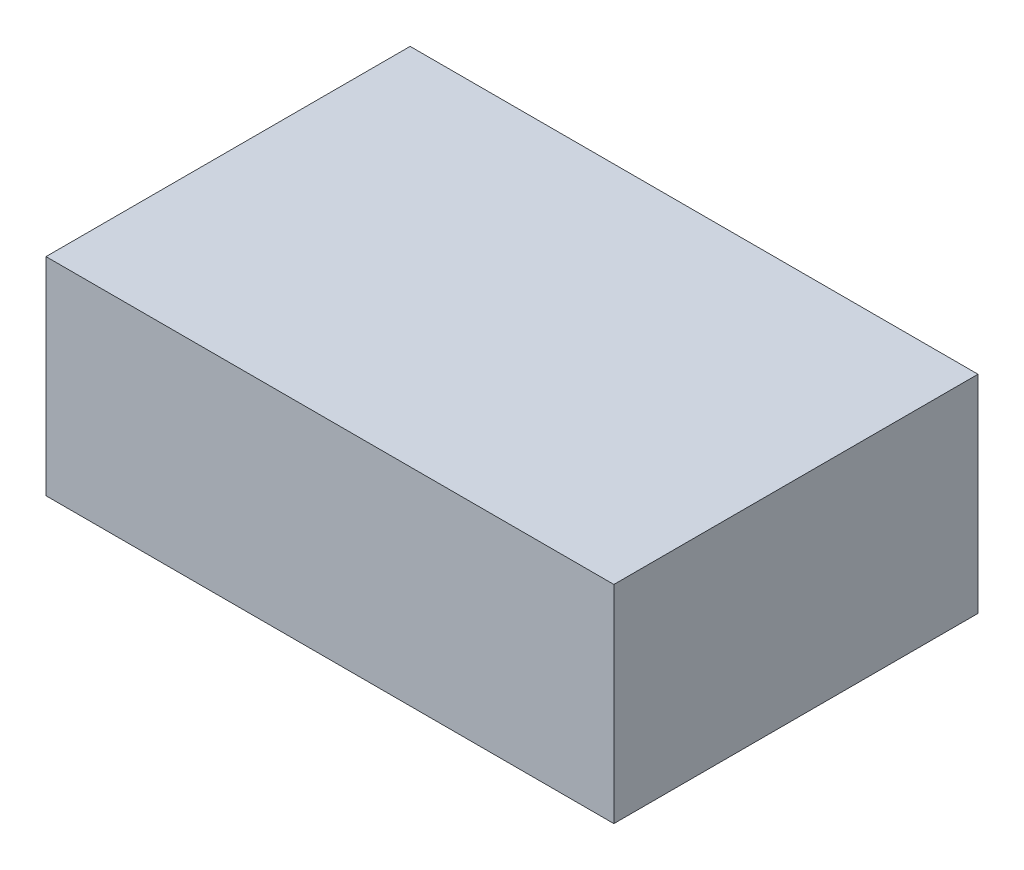
ISO-10303-21;
HEADER;
FILE_DESCRIPTION(('STEP AP214'),'2;1');
FILE_NAME('part.step','',(''),(''),'','','');
FILE_SCHEMA(('AUTOMOTIVE_DESIGN { 1 0 10303 214 1 1 1 1 }'));
ENDSEC;
DATA;
#1=APPLICATION_CONTEXT('core data for automotive mechanical design processes');
#2=APPLICATION_PROTOCOL_DEFINITION('international standard','automotive_design',2000,#1);
#3=PRODUCT_CONTEXT('',#1,'mechanical');
#4=PRODUCT('Part','Part','',(#3));
#5=PRODUCT_RELATED_PRODUCT_CATEGORY('part','',(#4));
#6=PRODUCT_DEFINITION_FORMATION('','',#4);
#7=PRODUCT_DEFINITION_CONTEXT('part definition',#1,'design');
#8=PRODUCT_DEFINITION('design','',#6,#7);
#9=PRODUCT_DEFINITION_SHAPE('','',#8);
#10=(LENGTH_UNIT() NAMED_UNIT(*) SI_UNIT(.MILLI.,.METRE.));
#11=(NAMED_UNIT(*) PLANE_ANGLE_UNIT() SI_UNIT($,.RADIAN.));
#12=(NAMED_UNIT(*) SI_UNIT($,.STERADIAN.) SOLID_ANGLE_UNIT());
#13=UNCERTAINTY_MEASURE_WITH_UNIT(LENGTH_MEASURE(1.E-05),#10,'distance_accuracy_value','');
#14=(GEOMETRIC_REPRESENTATION_CONTEXT(3) GLOBAL_UNCERTAINTY_ASSIGNED_CONTEXT((#13)) GLOBAL_UNIT_ASSIGNED_CONTEXT((#10,
#11,#12)) REPRESENTATION_CONTEXT('',''));
#15=CARTESIAN_POINT('',(0.,0.,0.));
#16=DIRECTION('',(0.,0.,1.));
#17=DIRECTION('',(1.,0.,0.));
#18=AXIS2_PLACEMENT_3D('',#15,#16,#17);
#19=CARTESIAN_POINT('',(0.,31.88,0.));
#20=DIRECTION('',(1.,0.,0.));
#21=DIRECTION('',(0.,0.,-1.));
#22=AXIS2_PLACEMENT_3D('',#19,#20,#21);
#23=PLANE('',#22);
#24=DIRECTION('',(0.,0.,1.));
#25=VECTOR('',#24,1.);
#26=CARTESIAN_POINT('',(0.,0.,0.));
#27=LINE('',#26,#25);
#28=CARTESIAN_POINT('',(0.,0.,-56.04));
#29=VERTEX_POINT('',#28);
#30=CARTESIAN_POINT('',(0.,0.,0.));
#31=VERTEX_POINT('',#30);
#32=EDGE_CURVE('E100',#29,#31,#27,.T.);
#33=ORIENTED_EDGE('',*,*,#32,.T.);
#34=DIRECTION('',(0.,-1.,0.));
#35=VECTOR('',#34,1.);
#36=CARTESIAN_POINT('',(0.,31.88,0.));
#37=LINE('',#36,#35);
#38=CARTESIAN_POINT('',(0.,31.88,0.));
#39=VERTEX_POINT('',#38);
#40=EDGE_CURVE('E11',#39,#31,#37,.T.);
#41=ORIENTED_EDGE('',*,*,#40,.F.);
#42=DIRECTION('',(0.,0.,1.));
#43=VECTOR('',#42,1.);
#44=CARTESIAN_POINT('',(0.,31.88,0.));
#45=LINE('',#44,#43);
#46=CARTESIAN_POINT('',(0.,31.88,-56.04));
#47=VERTEX_POINT('',#46);
#48=EDGE_CURVE('E88',#47,#39,#45,.T.);
#49=ORIENTED_EDGE('',*,*,#48,.F.);
#50=DIRECTION('',(0.,-1.,0.));
#51=VECTOR('',#50,1.);
#52=CARTESIAN_POINT('',(0.,31.88,-56.04));
#53=LINE('',#52,#51);
#54=EDGE_CURVE('E96',#47,#29,#53,.T.);
#55=ORIENTED_EDGE('',*,*,#54,.T.);
#56=EDGE_LOOP('',(#33,#41,#49,#55));
#57=FACE_BOUND('',#56,.T.);
#58=ADVANCED_FACE('F37',(#57),#23,.F.);
#59=CARTESIAN_POINT('',(0.,31.88,0.));
#60=DIRECTION('',(0.,0.,-1.));
#61=DIRECTION('',(-1.,0.,0.));
#62=AXIS2_PLACEMENT_3D('',#59,#60,#61);
#63=PLANE('',#62);
#64=DIRECTION('',(1.,0.,0.));
#65=VECTOR('',#64,1.);
#66=CARTESIAN_POINT('',(0.,0.,0.));
#67=LINE('',#66,#65);
#68=CARTESIAN_POINT('',(87.4,0.,0.));
#69=VERTEX_POINT('',#68);
#70=EDGE_CURVE('E92',#31,#69,#67,.T.);
#71=ORIENTED_EDGE('',*,*,#70,.T.);
#72=DIRECTION('',(0.,-1.,0.));
#73=VECTOR('',#72,1.);
#74=CARTESIAN_POINT('',(87.4,31.88,0.));
#75=LINE('',#74,#73);
#76=CARTESIAN_POINT('',(87.4,31.88,0.));
#77=VERTEX_POINT('',#76);
#78=EDGE_CURVE('E45',#77,#69,#75,.T.);
#79=ORIENTED_EDGE('',*,*,#78,.F.);
#80=DIRECTION('',(1.,0.,0.));
#81=VECTOR('',#80,1.);
#82=CARTESIAN_POINT('',(0.,31.88,0.));
#83=LINE('',#82,#81);
#84=EDGE_CURVE('E83',#39,#77,#83,.T.);
#85=ORIENTED_EDGE('',*,*,#84,.F.);
#86=ORIENTED_EDGE('',*,*,#40,.T.);
#87=EDGE_LOOP('',(#71,#79,#85,#86));
#88=FACE_BOUND('',#87,.T.);
#89=ADVANCED_FACE('F91',(#88),#63,.F.);
#90=CARTESIAN_POINT('',(87.4,31.88,0.));
#91=DIRECTION('',(-1.,0.,0.));
#92=DIRECTION('',(0.,0.,1.));
#93=AXIS2_PLACEMENT_3D('',#90,#91,#92);
#94=PLANE('',#93);
#95=DIRECTION('',(0.,0.,-1.));
#96=VECTOR('',#95,1.);
#97=CARTESIAN_POINT('',(87.4,0.,0.));
#98=LINE('',#97,#96);
#99=CARTESIAN_POINT('',(87.4,0.,-56.04));
#100=VERTEX_POINT('',#99);
#101=EDGE_CURVE('E70',#69,#100,#98,.T.);
#102=ORIENTED_EDGE('',*,*,#101,.T.);
#103=DIRECTION('',(0.,-1.,0.));
#104=VECTOR('',#103,1.);
#105=CARTESIAN_POINT('',(87.4,31.88,-56.04));
#106=LINE('',#105,#104);
#107=CARTESIAN_POINT('',(87.4,31.88,-56.04));
#108=VERTEX_POINT('',#107);
#109=EDGE_CURVE('E93',#108,#100,#106,.T.);
#110=ORIENTED_EDGE('',*,*,#109,.F.);
#111=DIRECTION('',(0.,0.,-1.));
#112=VECTOR('',#111,1.);
#113=CARTESIAN_POINT('',(87.4,31.88,0.));
#114=LINE('',#113,#112);
#115=EDGE_CURVE('E86',#77,#108,#114,.T.);
#116=ORIENTED_EDGE('',*,*,#115,.F.);
#117=ORIENTED_EDGE('',*,*,#78,.T.);
#118=EDGE_LOOP('',(#102,#110,#116,#117));
#119=FACE_BOUND('',#118,.T.);
#120=ADVANCED_FACE('F94',(#119),#94,.F.);
#121=CARTESIAN_POINT('',(0.,31.88,-56.04));
#122=DIRECTION('',(0.,0.,1.));
#123=DIRECTION('',(1.,0.,0.));
#124=AXIS2_PLACEMENT_3D('',#121,#122,#123);
#125=PLANE('',#124);
#126=DIRECTION('',(-1.,0.,0.));
#127=VECTOR('',#126,1.);
#128=CARTESIAN_POINT('',(0.,0.,-56.04));
#129=LINE('',#128,#127);
#130=EDGE_CURVE('E76',#100,#29,#129,.T.);
#131=ORIENTED_EDGE('',*,*,#130,.T.);
#132=ORIENTED_EDGE('',*,*,#54,.F.);
#133=DIRECTION('',(-1.,0.,0.));
#134=VECTOR('',#133,1.);
#135=CARTESIAN_POINT('',(0.,31.88,-56.04));
#136=LINE('',#135,#134);
#137=EDGE_CURVE('E53',#108,#47,#136,.T.);
#138=ORIENTED_EDGE('',*,*,#137,.F.);
#139=ORIENTED_EDGE('',*,*,#109,.T.);
#140=EDGE_LOOP('',(#131,#132,#138,#139));
#141=FACE_BOUND('',#140,.T.);
#142=ADVANCED_FACE('F107',(#141),#125,.F.);
#143=CARTESIAN_POINT('',(0.,31.88,0.));
#144=DIRECTION('',(0.,-1.,0.));
#145=DIRECTION('',(0.,0.,-1.));
#146=AXIS2_PLACEMENT_3D('',#143,#144,#145);
#147=PLANE('',#146);
#148=ORIENTED_EDGE('',*,*,#48,.T.);
#149=ORIENTED_EDGE('',*,*,#84,.T.);
#150=ORIENTED_EDGE('',*,*,#115,.T.);
#151=ORIENTED_EDGE('',*,*,#137,.T.);
#152=EDGE_LOOP('',(#148,#149,#150,#151));
#153=FACE_BOUND('',#152,.T.);
#154=ADVANCED_FACE('F84',(#153),#147,.F.);
#155=CARTESIAN_POINT('',(0.,0.,0.));
#156=DIRECTION('',(0.,-1.,0.));
#157=DIRECTION('',(0.,0.,-1.));
#158=AXIS2_PLACEMENT_3D('',#155,#156,#157);
#159=PLANE('',#158);
#160=ORIENTED_EDGE('',*,*,#32,.F.);
#161=ORIENTED_EDGE('',*,*,#130,.F.);
#162=ORIENTED_EDGE('',*,*,#101,.F.);
#163=ORIENTED_EDGE('',*,*,#70,.F.);
#164=EDGE_LOOP('',(#160,#161,#162,#163));
#165=FACE_BOUND('',#164,.T.);
#166=ADVANCED_FACE('F110',(#165),#159,.T.);
#167=CLOSED_SHELL('',(#58,#89,#120,#142,#154,#166));
#168=MANIFOLD_SOLID_BREP('B2',#167);
#169=ADVANCED_BREP_SHAPE_REPRESENTATION('',(#18,#168),#14);
#170=SHAPE_DEFINITION_REPRESENTATION(#9,#169);
ENDSEC;
END-ISO-10303-21;
